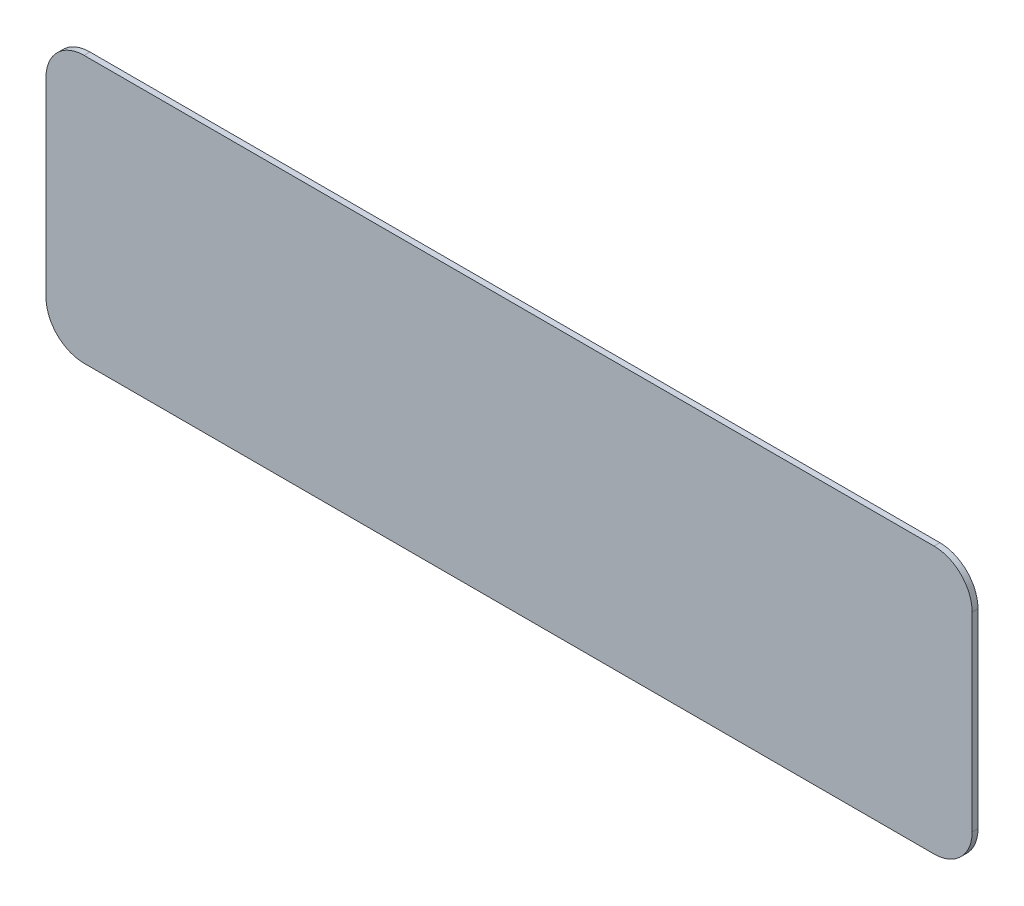
ISO-10303-21;
HEADER;
FILE_DESCRIPTION(('STEP AP214'),'2;1');
FILE_NAME('part.step','',(''),(''),'','','');
FILE_SCHEMA(('AUTOMOTIVE_DESIGN { 1 0 10303 214 1 1 1 1 }'));
ENDSEC;
DATA;
#1=APPLICATION_CONTEXT('core data for automotive mechanical design processes');
#2=APPLICATION_PROTOCOL_DEFINITION('international standard','automotive_design',2000,#1);
#3=PRODUCT_CONTEXT('',#1,'mechanical');
#4=PRODUCT('Part','Part','',(#3));
#5=PRODUCT_RELATED_PRODUCT_CATEGORY('part','',(#4));
#6=PRODUCT_DEFINITION_FORMATION('','',#4);
#7=PRODUCT_DEFINITION_CONTEXT('part definition',#1,'design');
#8=PRODUCT_DEFINITION('design','',#6,#7);
#9=PRODUCT_DEFINITION_SHAPE('','',#8);
#10=(LENGTH_UNIT() NAMED_UNIT(*) SI_UNIT(.MILLI.,.METRE.));
#11=(NAMED_UNIT(*) PLANE_ANGLE_UNIT() SI_UNIT($,.RADIAN.));
#12=(NAMED_UNIT(*) SI_UNIT($,.STERADIAN.) SOLID_ANGLE_UNIT());
#13=UNCERTAINTY_MEASURE_WITH_UNIT(LENGTH_MEASURE(1.E-05),#10,'distance_accuracy_value','');
#14=(GEOMETRIC_REPRESENTATION_CONTEXT(3) GLOBAL_UNCERTAINTY_ASSIGNED_CONTEXT((#13)) GLOBAL_UNIT_ASSIGNED_CONTEXT((#10,
#11,#12)) REPRESENTATION_CONTEXT('',''));
#15=CARTESIAN_POINT('',(0.,0.,0.));
#16=DIRECTION('',(0.,0.,1.));
#17=DIRECTION('',(1.,0.,0.));
#18=AXIS2_PLACEMENT_3D('',#15,#16,#17);
#19=CARTESIAN_POINT('',(0.,0.,0.6));
#20=DIRECTION('',(0.,0.,1.));
#21=DIRECTION('',(1.,0.,0.));
#22=AXIS2_PLACEMENT_3D('',#19,#20,#21);
#23=PLANE('',#22);
#24=DIRECTION('',(-1.,0.,0.));
#25=VECTOR('',#24,1.);
#26=CARTESIAN_POINT('',(43.5,8.9,0.6));
#27=LINE('',#26,#25);
#28=CARTESIAN_POINT('',(43.5,8.9,0.6));
#29=VERTEX_POINT('',#28);
#30=CARTESIAN_POINT('',(-43.5,8.9,0.6));
#31=VERTEX_POINT('',#30);
#32=EDGE_CURVE('E11',#29,#31,#27,.T.);
#33=ORIENTED_EDGE('',*,*,#32,.T.);
#34=CARTESIAN_POINT('',(-43.5,5.,0.6));
#35=DIRECTION('',(0.,0.,1.));
#36=DIRECTION('',(0.,1.,0.));
#37=AXIS2_PLACEMENT_3D('',#34,#35,#36);
#38=CIRCLE('',#37,3.9);
#39=CARTESIAN_POINT('',(-47.4,5.,0.6));
#40=VERTEX_POINT('',#39);
#41=EDGE_CURVE('E228',#31,#40,#38,.T.);
#42=ORIENTED_EDGE('',*,*,#41,.T.);
#43=DIRECTION('',(0.,-1.,0.));
#44=VECTOR('',#43,1.);
#45=CARTESIAN_POINT('',(-47.4,5.,0.6));
#46=LINE('',#45,#44);
#47=CARTESIAN_POINT('',(-47.4,-14.5,0.6));
#48=VERTEX_POINT('',#47);
#49=EDGE_CURVE('E218',#40,#48,#46,.T.);
#50=ORIENTED_EDGE('',*,*,#49,.T.);
#51=CARTESIAN_POINT('',(-43.5,-14.5,0.6));
#52=DIRECTION('',(0.,0.,1.));
#53=DIRECTION('',(-1.,0.,0.));
#54=AXIS2_PLACEMENT_3D('',#51,#52,#53);
#55=CIRCLE('',#54,3.9);
#56=CARTESIAN_POINT('',(-43.5,-18.4,0.6));
#57=VERTEX_POINT('',#56);
#58=EDGE_CURVE('E204',#48,#57,#55,.T.);
#59=ORIENTED_EDGE('',*,*,#58,.T.);
#60=DIRECTION('',(1.,0.,0.));
#61=VECTOR('',#60,1.);
#62=CARTESIAN_POINT('',(-43.5,-18.4,0.6));
#63=LINE('',#62,#61);
#64=CARTESIAN_POINT('',(43.5,-18.4,0.6));
#65=VERTEX_POINT('',#64);
#66=EDGE_CURVE('E205',#57,#65,#63,.T.);
#67=ORIENTED_EDGE('',*,*,#66,.T.);
#68=CARTESIAN_POINT('',(43.5,-14.5,0.6));
#69=DIRECTION('',(0.,0.,1.));
#70=DIRECTION('',(0.,-1.,0.));
#71=AXIS2_PLACEMENT_3D('',#68,#69,#70);
#72=CIRCLE('',#71,3.9);
#73=CARTESIAN_POINT('',(47.4,-14.5,0.6));
#74=VERTEX_POINT('',#73);
#75=EDGE_CURVE('E239',#65,#74,#72,.T.);
#76=ORIENTED_EDGE('',*,*,#75,.T.);
#77=DIRECTION('',(0.,1.,0.));
#78=VECTOR('',#77,1.);
#79=CARTESIAN_POINT('',(47.4,-14.5,0.6));
#80=LINE('',#79,#78);
#81=CARTESIAN_POINT('',(47.4,5.,0.6));
#82=VERTEX_POINT('',#81);
#83=EDGE_CURVE('E107',#74,#82,#80,.T.);
#84=ORIENTED_EDGE('',*,*,#83,.T.);
#85=CARTESIAN_POINT('',(43.5,5.,0.6));
#86=DIRECTION('',(0.,0.,1.));
#87=DIRECTION('',(1.,0.,0.));
#88=AXIS2_PLACEMENT_3D('',#85,#86,#87);
#89=CIRCLE('',#88,3.9);
#90=EDGE_CURVE('E254',#82,#29,#89,.T.);
#91=ORIENTED_EDGE('',*,*,#90,.T.);
#92=EDGE_LOOP('',(#33,#42,#50,#59,#67,#76,#84,#91));
#93=FACE_BOUND('',#92,.T.);
#94=ADVANCED_FACE('F17',(#93),#23,.T.);
#95=CARTESIAN_POINT('',(47.4,8.9,0.));
#96=DIRECTION('',(0.,1.,0.));
#97=DIRECTION('',(1.,0.,0.));
#98=AXIS2_PLACEMENT_3D('',#95,#96,#97);
#99=PLANE('',#98);
#100=DIRECTION('',(-1.,0.,0.));
#101=VECTOR('',#100,1.);
#102=CARTESIAN_POINT('',(43.5,8.9,0.));
#103=LINE('',#102,#101);
#104=CARTESIAN_POINT('',(43.5,8.9,0.));
#105=VERTEX_POINT('',#104);
#106=CARTESIAN_POINT('',(-43.5,8.9,0.));
#107=VERTEX_POINT('',#106);
#108=EDGE_CURVE('E238',#105,#107,#103,.T.);
#109=ORIENTED_EDGE('',*,*,#108,.T.);
#110=DIRECTION('',(0.,0.,-1.));
#111=VECTOR('',#110,1.);
#112=CARTESIAN_POINT('',(-43.5,8.9,0.6));
#113=LINE('',#112,#111);
#114=EDGE_CURVE('E27',#31,#107,#113,.T.);
#115=ORIENTED_EDGE('',*,*,#114,.F.);
#116=ORIENTED_EDGE('',*,*,#32,.F.);
#117=DIRECTION('',(0.,0.,-1.));
#118=VECTOR('',#117,1.);
#119=CARTESIAN_POINT('',(43.5,8.9,0.6));
#120=LINE('',#119,#118);
#121=EDGE_CURVE('E262',#29,#105,#120,.T.);
#122=ORIENTED_EDGE('',*,*,#121,.T.);
#123=EDGE_LOOP('',(#109,#115,#116,#122));
#124=FACE_BOUND('',#123,.T.);
#125=ADVANCED_FACE('F362',(#124),#99,.T.);
#126=CARTESIAN_POINT('',(-43.5,5.,5.35008));
#127=DIRECTION('',(0.,0.,-1.));
#128=DIRECTION('',(-1.,0.,0.));
#129=AXIS2_PLACEMENT_3D('',#126,#127,#128);
#130=CYLINDRICAL_SURFACE('',#129,3.9);
#131=DIRECTION('',(0.,0.,-1.));
#132=VECTOR('',#131,1.);
#133=CARTESIAN_POINT('',(-47.4,5.,0.6));
#134=LINE('',#133,#132);
#135=CARTESIAN_POINT('',(-47.4,5.,0.));
#136=VERTEX_POINT('',#135);
#137=EDGE_CURVE('E231',#40,#136,#134,.T.);
#138=ORIENTED_EDGE('',*,*,#137,.F.);
#139=ORIENTED_EDGE('',*,*,#41,.F.);
#140=ORIENTED_EDGE('',*,*,#114,.T.);
#141=CARTESIAN_POINT('',(-43.5,5.,0.));
#142=DIRECTION('',(0.,0.,-1.));
#143=DIRECTION('',(-1.,0.,0.));
#144=AXIS2_PLACEMENT_3D('',#141,#142,#143);
#145=CIRCLE('',#144,3.9);
#146=EDGE_CURVE('E278',#136,#107,#145,.T.);
#147=ORIENTED_EDGE('',*,*,#146,.F.);
#148=EDGE_LOOP('',(#138,#139,#140,#147));
#149=FACE_BOUND('',#148,.T.);
#150=ADVANCED_FACE('F323',(#149),#130,.T.);
#151=CARTESIAN_POINT('',(-47.4,8.9,0.));
#152=DIRECTION('',(-1.,0.,0.));
#153=DIRECTION('',(0.,0.,1.));
#154=AXIS2_PLACEMENT_3D('',#151,#152,#153);
#155=PLANE('',#154);
#156=DIRECTION('',(0.,-1.,0.));
#157=VECTOR('',#156,1.);
#158=CARTESIAN_POINT('',(-47.4,5.,0.));
#159=LINE('',#158,#157);
#160=CARTESIAN_POINT('',(-47.4,-14.5,0.));
#161=VERTEX_POINT('',#160);
#162=EDGE_CURVE('E222',#136,#161,#159,.T.);
#163=ORIENTED_EDGE('',*,*,#162,.T.);
#164=DIRECTION('',(0.,0.,-1.));
#165=VECTOR('',#164,1.);
#166=CARTESIAN_POINT('',(-47.4,-14.5,0.6));
#167=LINE('',#166,#165);
#168=EDGE_CURVE('E208',#48,#161,#167,.T.);
#169=ORIENTED_EDGE('',*,*,#168,.F.);
#170=ORIENTED_EDGE('',*,*,#49,.F.);
#171=ORIENTED_EDGE('',*,*,#137,.T.);
#172=EDGE_LOOP('',(#163,#169,#170,#171));
#173=FACE_BOUND('',#172,.T.);
#174=ADVANCED_FACE('F328',(#173),#155,.T.);
#175=CARTESIAN_POINT('',(-43.5,-14.5,5.35008));
#176=DIRECTION('',(0.,0.,-1.));
#177=DIRECTION('',(0.,-1.,0.));
#178=AXIS2_PLACEMENT_3D('',#175,#176,#177);
#179=CYLINDRICAL_SURFACE('',#178,3.9);
#180=DIRECTION('',(0.,0.,-1.));
#181=VECTOR('',#180,1.);
#182=CARTESIAN_POINT('',(-43.5,-18.4,0.6));
#183=LINE('',#182,#181);
#184=CARTESIAN_POINT('',(-43.5,-18.4,0.));
#185=VERTEX_POINT('',#184);
#186=EDGE_CURVE('E202',#57,#185,#183,.T.);
#187=ORIENTED_EDGE('',*,*,#186,.F.);
#188=ORIENTED_EDGE('',*,*,#58,.F.);
#189=ORIENTED_EDGE('',*,*,#168,.T.);
#190=CARTESIAN_POINT('',(-43.5,-14.5,0.));
#191=DIRECTION('',(0.,0.,-1.));
#192=DIRECTION('',(0.,-1.,0.));
#193=AXIS2_PLACEMENT_3D('',#190,#191,#192);
#194=CIRCLE('',#193,3.9);
#195=EDGE_CURVE('E219',#185,#161,#194,.T.);
#196=ORIENTED_EDGE('',*,*,#195,.F.);
#197=EDGE_LOOP('',(#187,#188,#189,#196));
#198=FACE_BOUND('',#197,.T.);
#199=ADVANCED_FACE('F336',(#198),#179,.T.);
#200=CARTESIAN_POINT('',(-47.4,-18.4,0.));
#201=DIRECTION('',(0.,-1.,0.));
#202=DIRECTION('',(0.,0.,-1.));
#203=AXIS2_PLACEMENT_3D('',#200,#201,#202);
#204=PLANE('',#203);
#205=ORIENTED_EDGE('',*,*,#66,.F.);
#206=ORIENTED_EDGE('',*,*,#186,.T.);
#207=DIRECTION('',(1.,0.,0.));
#208=VECTOR('',#207,1.);
#209=CARTESIAN_POINT('',(-43.5,-18.4,0.));
#210=LINE('',#209,#208);
#211=CARTESIAN_POINT('',(43.5,-18.4,0.));
#212=VERTEX_POINT('',#211);
#213=EDGE_CURVE('E223',#185,#212,#210,.T.);
#214=ORIENTED_EDGE('',*,*,#213,.T.);
#215=DIRECTION('',(0.,0.,-1.));
#216=VECTOR('',#215,1.);
#217=CARTESIAN_POINT('',(43.5,-18.4,0.6));
#218=LINE('',#217,#216);
#219=EDGE_CURVE('E215',#65,#212,#218,.T.);
#220=ORIENTED_EDGE('',*,*,#219,.F.);
#221=EDGE_LOOP('',(#205,#206,#214,#220));
#222=FACE_BOUND('',#221,.T.);
#223=ADVANCED_FACE('F339',(#222),#204,.T.);
#224=CARTESIAN_POINT('',(43.5,-14.5,5.35008));
#225=DIRECTION('',(0.,0.,-1.));
#226=DIRECTION('',(1.,0.,0.));
#227=AXIS2_PLACEMENT_3D('',#224,#225,#226);
#228=CYLINDRICAL_SURFACE('',#227,3.9);
#229=DIRECTION('',(0.,0.,-1.));
#230=VECTOR('',#229,1.);
#231=CARTESIAN_POINT('',(47.4,-14.5,0.6));
#232=LINE('',#231,#230);
#233=CARTESIAN_POINT('',(47.4,-14.5,0.));
#234=VERTEX_POINT('',#233);
#235=EDGE_CURVE('E242',#74,#234,#232,.T.);
#236=ORIENTED_EDGE('',*,*,#235,.F.);
#237=ORIENTED_EDGE('',*,*,#75,.F.);
#238=ORIENTED_EDGE('',*,*,#219,.T.);
#239=CARTESIAN_POINT('',(43.5,-14.5,0.));
#240=DIRECTION('',(0.,0.,-1.));
#241=DIRECTION('',(1.,0.,0.));
#242=AXIS2_PLACEMENT_3D('',#239,#240,#241);
#243=CIRCLE('',#242,3.9);
#244=EDGE_CURVE('E283',#234,#212,#243,.T.);
#245=ORIENTED_EDGE('',*,*,#244,.F.);
#246=EDGE_LOOP('',(#236,#237,#238,#245));
#247=FACE_BOUND('',#246,.T.);
#248=ADVANCED_FACE('F344',(#247),#228,.T.);
#249=CARTESIAN_POINT('',(47.4,-18.4,0.));
#250=DIRECTION('',(1.,0.,0.));
#251=DIRECTION('',(0.,1.,0.));
#252=AXIS2_PLACEMENT_3D('',#249,#250,#251);
#253=PLANE('',#252);
#254=ORIENTED_EDGE('',*,*,#83,.F.);
#255=ORIENTED_EDGE('',*,*,#235,.T.);
#256=DIRECTION('',(0.,1.,0.));
#257=VECTOR('',#256,1.);
#258=CARTESIAN_POINT('',(47.4,-14.5,0.));
#259=LINE('',#258,#257);
#260=CARTESIAN_POINT('',(47.4,5.,0.));
#261=VERTEX_POINT('',#260);
#262=EDGE_CURVE('E279',#234,#261,#259,.T.);
#263=ORIENTED_EDGE('',*,*,#262,.T.);
#264=DIRECTION('',(0.,0.,-1.));
#265=VECTOR('',#264,1.);
#266=CARTESIAN_POINT('',(47.4,5.,0.6));
#267=LINE('',#266,#265);
#268=EDGE_CURVE('E251',#82,#261,#267,.T.);
#269=ORIENTED_EDGE('',*,*,#268,.F.);
#270=EDGE_LOOP('',(#254,#255,#263,#269));
#271=FACE_BOUND('',#270,.T.);
#272=ADVANCED_FACE('F19',(#271),#253,.T.);
#273=CARTESIAN_POINT('',(43.5,5.,5.35008));
#274=DIRECTION('',(0.,0.,-1.));
#275=DIRECTION('',(0.,1.,0.));
#276=AXIS2_PLACEMENT_3D('',#273,#274,#275);
#277=CYLINDRICAL_SURFACE('',#276,3.9);
#278=ORIENTED_EDGE('',*,*,#121,.F.);
#279=ORIENTED_EDGE('',*,*,#90,.F.);
#280=ORIENTED_EDGE('',*,*,#268,.T.);
#281=CARTESIAN_POINT('',(43.5,5.,0.));
#282=DIRECTION('',(0.,0.,-1.));
#283=DIRECTION('',(0.,1.,0.));
#284=AXIS2_PLACEMENT_3D('',#281,#282,#283);
#285=CIRCLE('',#284,3.9);
#286=EDGE_CURVE('E234',#105,#261,#285,.T.);
#287=ORIENTED_EDGE('',*,*,#286,.F.);
#288=EDGE_LOOP('',(#278,#279,#280,#287));
#289=FACE_BOUND('',#288,.T.);
#290=ADVANCED_FACE('F348',(#289),#277,.T.);
#291=CARTESIAN_POINT('',(37.5,0.,0.));
#292=DIRECTION('',(0.,0.,1.));
#293=DIRECTION('',(1.,0.,0.));
#294=AXIS2_PLACEMENT_3D('',#291,#292,#293);
#295=CYLINDRICAL_SURFACE('',#294,4.25);
#296=DIRECTION('',(0.,0.,1.));
#297=VECTOR('',#296,1.);
#298=CARTESIAN_POINT('',(33.25,0.,0.));
#299=LINE('',#298,#297);
#300=CARTESIAN_POINT('',(33.25,0.,0.));
#301=VERTEX_POINT('',#300);
#302=CARTESIAN_POINT('',(33.25,0.,0.03));
#303=VERTEX_POINT('',#302);
#304=EDGE_CURVE('E227',#301,#303,#299,.T.);
#305=ORIENTED_EDGE('',*,*,#304,.F.);
#306=CARTESIAN_POINT('',(37.5,0.,0.));
#307=DIRECTION('',(0.,0.,-1.));
#308=DIRECTION('',(-1.,0.,0.));
#309=AXIS2_PLACEMENT_3D('',#306,#307,#308);
#310=CIRCLE('',#309,4.25);
#311=CARTESIAN_POINT('',(41.75,0.,0.));
#312=VERTEX_POINT('',#311);
#313=EDGE_CURVE('E301',#301,#312,#310,.T.);
#314=ORIENTED_EDGE('',*,*,#313,.T.);
#315=DIRECTION('',(0.,0.,1.));
#316=VECTOR('',#315,1.);
#317=CARTESIAN_POINT('',(41.75,0.,0.));
#318=LINE('',#317,#316);
#319=CARTESIAN_POINT('',(41.75,0.,0.03));
#320=VERTEX_POINT('',#319);
#321=EDGE_CURVE('E140',#312,#320,#318,.T.);
#322=ORIENTED_EDGE('',*,*,#321,.T.);
#323=CARTESIAN_POINT('',(37.5,0.,0.03));
#324=DIRECTION('',(0.,0.,1.));
#325=DIRECTION('',(1.,0.,0.));
#326=AXIS2_PLACEMENT_3D('',#323,#324,#325);
#327=CIRCLE('',#326,4.25);
#328=EDGE_CURVE('E186',#320,#303,#327,.T.);
#329=ORIENTED_EDGE('',*,*,#328,.T.);
#330=EDGE_LOOP('',(#305,#314,#322,#329));
#331=FACE_BOUND('',#330,.T.);
#332=ADVANCED_FACE('F350',(#331),#295,.F.);
#333=CARTESIAN_POINT('',(37.5,0.,0.));
#334=DIRECTION('',(0.,0.,1.));
#335=DIRECTION('',(1.,0.,0.));
#336=AXIS2_PLACEMENT_3D('',#333,#334,#335);
#337=CYLINDRICAL_SURFACE('',#336,4.25);
#338=ORIENTED_EDGE('',*,*,#321,.F.);
#339=CARTESIAN_POINT('',(37.5,0.,0.));
#340=DIRECTION('',(0.,0.,-1.));
#341=DIRECTION('',(1.,0.,0.));
#342=AXIS2_PLACEMENT_3D('',#339,#340,#341);
#343=CIRCLE('',#342,4.25);
#344=EDGE_CURVE('E294',#312,#301,#343,.T.);
#345=ORIENTED_EDGE('',*,*,#344,.T.);
#346=ORIENTED_EDGE('',*,*,#304,.T.);
#347=CARTESIAN_POINT('',(37.5,0.,0.03));
#348=DIRECTION('',(0.,0.,1.));
#349=DIRECTION('',(-1.,0.,0.));
#350=AXIS2_PLACEMENT_3D('',#347,#348,#349);
#351=CIRCLE('',#350,4.25);
#352=EDGE_CURVE('E181',#303,#320,#351,.T.);
#353=ORIENTED_EDGE('',*,*,#352,.T.);
#354=EDGE_LOOP('',(#338,#345,#346,#353));
#355=FACE_BOUND('',#354,.T.);
#356=ADVANCED_FACE('F357',(#355),#337,.F.);
#357=CARTESIAN_POINT('',(0.,0.,0.));
#358=DIRECTION('',(0.,0.,1.));
#359=DIRECTION('',(1.,0.,0.));
#360=AXIS2_PLACEMENT_3D('',#357,#358,#359);
#361=CYLINDRICAL_SURFACE('',#360,4.25);
#362=DIRECTION('',(0.,0.,1.));
#363=VECTOR('',#362,1.);
#364=CARTESIAN_POINT('',(-4.25,0.,0.));
#365=LINE('',#364,#363);
#366=CARTESIAN_POINT('',(-4.25,0.,0.));
#367=VERTEX_POINT('',#366);
#368=CARTESIAN_POINT('',(-4.25,0.,0.03));
#369=VERTEX_POINT('',#368);
#370=EDGE_CURVE('E166',#367,#369,#365,.T.);
#371=ORIENTED_EDGE('',*,*,#370,.F.);
#372=CARTESIAN_POINT('',(0.,0.,0.));
#373=DIRECTION('',(0.,0.,-1.));
#374=DIRECTION('',(-1.,0.,0.));
#375=AXIS2_PLACEMENT_3D('',#372,#373,#374);
#376=CIRCLE('',#375,4.25);
#377=CARTESIAN_POINT('',(4.25,0.,0.));
#378=VERTEX_POINT('',#377);
#379=EDGE_CURVE('E178',#367,#378,#376,.T.);
#380=ORIENTED_EDGE('',*,*,#379,.T.);
#381=DIRECTION('',(0.,0.,1.));
#382=VECTOR('',#381,1.);
#383=CARTESIAN_POINT('',(4.25,0.,0.));
#384=LINE('',#383,#382);
#385=CARTESIAN_POINT('',(4.25,0.,0.03));
#386=VERTEX_POINT('',#385);
#387=EDGE_CURVE('E173',#378,#386,#384,.T.);
#388=ORIENTED_EDGE('',*,*,#387,.T.);
#389=CARTESIAN_POINT('',(0.,0.,0.03));
#390=DIRECTION('',(0.,0.,1.));
#391=DIRECTION('',(1.,0.,0.));
#392=AXIS2_PLACEMENT_3D('',#389,#390,#391);
#393=CIRCLE('',#392,4.25);
#394=EDGE_CURVE('E176',#386,#369,#393,.T.);
#395=ORIENTED_EDGE('',*,*,#394,.T.);
#396=EDGE_LOOP('',(#371,#380,#388,#395));
#397=FACE_BOUND('',#396,.T.);
#398=ADVANCED_FACE('F174',(#397),#361,.F.);
#399=CARTESIAN_POINT('',(0.,0.,0.));
#400=DIRECTION('',(0.,0.,1.));
#401=DIRECTION('',(1.,0.,0.));
#402=AXIS2_PLACEMENT_3D('',#399,#400,#401);
#403=CYLINDRICAL_SURFACE('',#402,4.25);
#404=ORIENTED_EDGE('',*,*,#387,.F.);
#405=CARTESIAN_POINT('',(0.,0.,0.));
#406=DIRECTION('',(0.,0.,-1.));
#407=DIRECTION('',(1.,0.,0.));
#408=AXIS2_PLACEMENT_3D('',#405,#406,#407);
#409=CIRCLE('',#408,4.25);
#410=EDGE_CURVE('E259',#378,#367,#409,.T.);
#411=ORIENTED_EDGE('',*,*,#410,.T.);
#412=ORIENTED_EDGE('',*,*,#370,.T.);
#413=CARTESIAN_POINT('',(0.,0.,0.03));
#414=DIRECTION('',(0.,0.,1.));
#415=DIRECTION('',(-1.,0.,0.));
#416=AXIS2_PLACEMENT_3D('',#413,#414,#415);
#417=CIRCLE('',#416,4.25);
#418=EDGE_CURVE('E182',#369,#386,#417,.T.);
#419=ORIENTED_EDGE('',*,*,#418,.T.);
#420=EDGE_LOOP('',(#404,#411,#412,#419));
#421=FACE_BOUND('',#420,.T.);
#422=ADVANCED_FACE('F183',(#421),#403,.F.);
#423=CARTESIAN_POINT('',(-37.5,0.,0.));
#424=DIRECTION('',(0.,0.,1.));
#425=DIRECTION('',(1.,0.,0.));
#426=AXIS2_PLACEMENT_3D('',#423,#424,#425);
#427=CYLINDRICAL_SURFACE('',#426,4.25);
#428=DIRECTION('',(0.,0.,1.));
#429=VECTOR('',#428,1.);
#430=CARTESIAN_POINT('',(-41.75,0.,0.));
#431=LINE('',#430,#429);
#432=CARTESIAN_POINT('',(-41.75,0.,0.));
#433=VERTEX_POINT('',#432);
#434=CARTESIAN_POINT('',(-41.75,0.,0.03));
#435=VERTEX_POINT('',#434);
#436=EDGE_CURVE('E124',#433,#435,#431,.T.);
#437=ORIENTED_EDGE('',*,*,#436,.F.);
#438=CARTESIAN_POINT('',(-37.5,0.,0.));
#439=DIRECTION('',(0.,0.,-1.));
#440=DIRECTION('',(-1.,0.,0.));
#441=AXIS2_PLACEMENT_3D('',#438,#439,#440);
#442=CIRCLE('',#441,4.25);
#443=CARTESIAN_POINT('',(-33.25,0.,0.));
#444=VERTEX_POINT('',#443);
#445=EDGE_CURVE('E291',#433,#444,#442,.T.);
#446=ORIENTED_EDGE('',*,*,#445,.T.);
#447=DIRECTION('',(0.,0.,1.));
#448=VECTOR('',#447,1.);
#449=CARTESIAN_POINT('',(-33.25,0.,0.));
#450=LINE('',#449,#448);
#451=CARTESIAN_POINT('',(-33.25,0.,0.03));
#452=VERTEX_POINT('',#451);
#453=EDGE_CURVE('E209',#444,#452,#450,.T.);
#454=ORIENTED_EDGE('',*,*,#453,.T.);
#455=CARTESIAN_POINT('',(-37.5,0.,0.03));
#456=DIRECTION('',(0.,0.,1.));
#457=DIRECTION('',(1.,0.,0.));
#458=AXIS2_PLACEMENT_3D('',#455,#456,#457);
#459=CIRCLE('',#458,4.25);
#460=EDGE_CURVE('E190',#452,#435,#459,.T.);
#461=ORIENTED_EDGE('',*,*,#460,.T.);
#462=EDGE_LOOP('',(#437,#446,#454,#461));
#463=FACE_BOUND('',#462,.T.);
#464=ADVANCED_FACE('F392',(#463),#427,.F.);
#465=CARTESIAN_POINT('',(0.,0.,0.03));
#466=DIRECTION('',(0.,0.,1.));
#467=DIRECTION('',(1.,0.,0.));
#468=AXIS2_PLACEMENT_3D('',#465,#466,#467);
#469=PLANE('',#468);
#470=ORIENTED_EDGE('',*,*,#328,.F.);
#471=ORIENTED_EDGE('',*,*,#352,.F.);
#472=EDGE_LOOP('',(#470,#471));
#473=FACE_BOUND('',#472,.T.);
#474=ADVANCED_FACE('F376',(#473),#469,.F.);
#475=CARTESIAN_POINT('',(0.,0.,0.03));
#476=DIRECTION('',(0.,0.,1.));
#477=DIRECTION('',(1.,0.,0.));
#478=AXIS2_PLACEMENT_3D('',#475,#476,#477);
#479=PLANE('',#478);
#480=ORIENTED_EDGE('',*,*,#394,.F.);
#481=ORIENTED_EDGE('',*,*,#418,.F.);
#482=EDGE_LOOP('',(#480,#481));
#483=FACE_BOUND('',#482,.T.);
#484=ADVANCED_FACE('F188',(#483),#479,.F.);
#485=CARTESIAN_POINT('',(0.,0.,0.03));
#486=DIRECTION('',(0.,0.,1.));
#487=DIRECTION('',(1.,0.,0.));
#488=AXIS2_PLACEMENT_3D('',#485,#486,#487);
#489=PLANE('',#488);
#490=ORIENTED_EDGE('',*,*,#460,.F.);
#491=CARTESIAN_POINT('',(-37.5,0.,0.03));
#492=DIRECTION('',(0.,0.,1.));
#493=DIRECTION('',(-1.,0.,0.));
#494=AXIS2_PLACEMENT_3D('',#491,#492,#493);
#495=CIRCLE('',#494,4.25);
#496=EDGE_CURVE('E196',#435,#452,#495,.T.);
#497=ORIENTED_EDGE('',*,*,#496,.F.);
#498=EDGE_LOOP('',(#490,#497));
#499=FACE_BOUND('',#498,.T.);
#500=ADVANCED_FACE('F375',(#499),#489,.F.);
#501=CARTESIAN_POINT('',(-37.5,0.,0.));
#502=DIRECTION('',(0.,0.,1.));
#503=DIRECTION('',(1.,0.,0.));
#504=AXIS2_PLACEMENT_3D('',#501,#502,#503);
#505=CYLINDRICAL_SURFACE('',#504,4.25);
#506=ORIENTED_EDGE('',*,*,#453,.F.);
#507=CARTESIAN_POINT('',(-37.5,0.,0.));
#508=DIRECTION('',(0.,0.,-1.));
#509=DIRECTION('',(1.,0.,0.));
#510=AXIS2_PLACEMENT_3D('',#507,#508,#509);
#511=CIRCLE('',#510,4.25);
#512=EDGE_CURVE('E200',#444,#433,#511,.T.);
#513=ORIENTED_EDGE('',*,*,#512,.T.);
#514=ORIENTED_EDGE('',*,*,#436,.T.);
#515=ORIENTED_EDGE('',*,*,#496,.T.);
#516=EDGE_LOOP('',(#506,#513,#514,#515));
#517=FACE_BOUND('',#516,.T.);
#518=ADVANCED_FACE('F378',(#517),#505,.F.);
#519=CARTESIAN_POINT('',(0.,0.,0.));
#520=DIRECTION('',(0.,0.,1.));
#521=DIRECTION('',(1.,0.,0.));
#522=AXIS2_PLACEMENT_3D('',#519,#520,#521);
#523=PLANE('',#522);
#524=ORIENTED_EDGE('',*,*,#445,.F.);
#525=ORIENTED_EDGE('',*,*,#512,.F.);
#526=EDGE_LOOP('',(#524,#525));
#527=FACE_BOUND('',#526,.T.);
#528=ORIENTED_EDGE('',*,*,#313,.F.);
#529=ORIENTED_EDGE('',*,*,#344,.F.);
#530=EDGE_LOOP('',(#528,#529));
#531=FACE_BOUND('',#530,.T.);
#532=ORIENTED_EDGE('',*,*,#379,.F.);
#533=ORIENTED_EDGE('',*,*,#410,.F.);
#534=EDGE_LOOP('',(#532,#533));
#535=FACE_BOUND('',#534,.T.);
#536=ORIENTED_EDGE('',*,*,#262,.F.);
#537=ORIENTED_EDGE('',*,*,#244,.T.);
#538=ORIENTED_EDGE('',*,*,#213,.F.);
#539=ORIENTED_EDGE('',*,*,#195,.T.);
#540=ORIENTED_EDGE('',*,*,#162,.F.);
#541=ORIENTED_EDGE('',*,*,#146,.T.);
#542=ORIENTED_EDGE('',*,*,#108,.F.);
#543=ORIENTED_EDGE('',*,*,#286,.T.);
#544=EDGE_LOOP('',(#536,#537,#538,#539,#540,#541,#542,#543));
#545=FACE_BOUND('',#544,.T.);
#546=ADVANCED_FACE('F320',(#527,#531,#535,#545),#523,.F.);
#547=CLOSED_SHELL('',(#94,#125,#150,#174,#199,#223,#248,#272,#290,#332,#356,#398,#422,#464,#474,
#484,#500,#518,#546));
#548=MANIFOLD_SOLID_BREP('B1',#547);
#549=ADVANCED_BREP_SHAPE_REPRESENTATION('',(#18,#548),#14);
#550=SHAPE_DEFINITION_REPRESENTATION(#9,#549);
ENDSEC;
END-ISO-10303-21;
